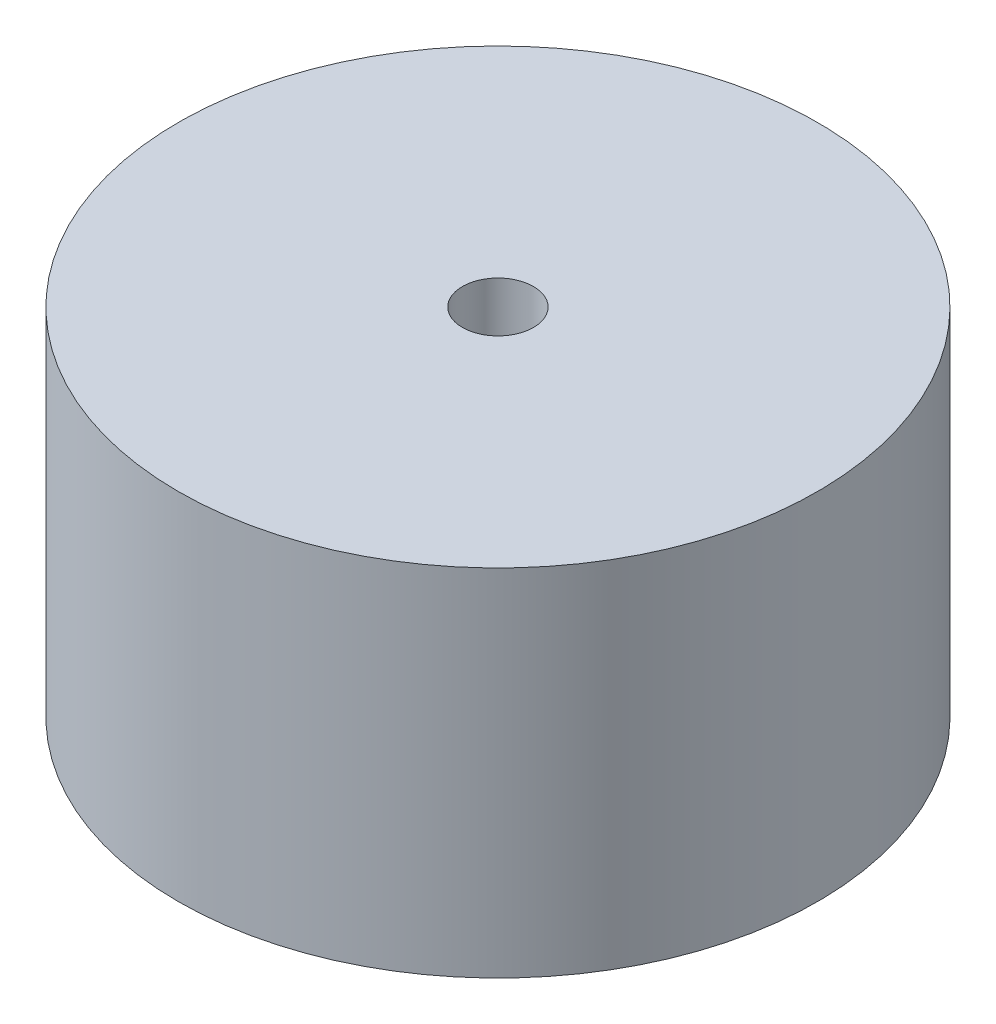
ISO-10303-21;
HEADER;
FILE_DESCRIPTION(('STEP AP214'),'2;1');
FILE_NAME('part.step','',(''),(''),'','','');
FILE_SCHEMA(('AUTOMOTIVE_DESIGN { 1 0 10303 214 1 1 1 1 }'));
ENDSEC;
DATA;
#1=APPLICATION_CONTEXT('core data for automotive mechanical design processes');
#2=APPLICATION_PROTOCOL_DEFINITION('international standard','automotive_design',2000,#1);
#3=PRODUCT_CONTEXT('',#1,'mechanical');
#4=PRODUCT('Part','Part','',(#3));
#5=PRODUCT_RELATED_PRODUCT_CATEGORY('part','',(#4));
#6=PRODUCT_DEFINITION_FORMATION('','',#4);
#7=PRODUCT_DEFINITION_CONTEXT('part definition',#1,'design');
#8=PRODUCT_DEFINITION('design','',#6,#7);
#9=PRODUCT_DEFINITION_SHAPE('','',#8);
#10=(LENGTH_UNIT() NAMED_UNIT(*) SI_UNIT(.MILLI.,.METRE.));
#11=(NAMED_UNIT(*) PLANE_ANGLE_UNIT() SI_UNIT($,.RADIAN.));
#12=(NAMED_UNIT(*) SI_UNIT($,.STERADIAN.) SOLID_ANGLE_UNIT());
#13=UNCERTAINTY_MEASURE_WITH_UNIT(LENGTH_MEASURE(1.E-05),#10,'distance_accuracy_value','');
#14=(GEOMETRIC_REPRESENTATION_CONTEXT(3) GLOBAL_UNCERTAINTY_ASSIGNED_CONTEXT((#13)) GLOBAL_UNIT_ASSIGNED_CONTEXT((#10,
#11,#12)) REPRESENTATION_CONTEXT('',''));
#15=CARTESIAN_POINT('',(0.,0.,0.));
#16=DIRECTION('',(0.,0.,1.));
#17=DIRECTION('',(1.,0.,0.));
#18=AXIS2_PLACEMENT_3D('',#15,#16,#17);
#19=CARTESIAN_POINT('',(0.,5.,0.));
#20=DIRECTION('',(0.,1.,0.));
#21=DIRECTION('',(0.,0.,1.));
#22=AXIS2_PLACEMENT_3D('',#19,#20,#21);
#23=PLANE('',#22);
#24=CARTESIAN_POINT('',(0.,5.,0.));
#25=DIRECTION('',(0.,1.,0.));
#26=DIRECTION('',(0.,0.,1.));
#27=AXIS2_PLACEMENT_3D('',#24,#25,#26);
#28=CIRCLE('',#27,4.5);
#29=CARTESIAN_POINT('',(0.,5.,4.5));
#30=VERTEX_POINT('',#29);
#31=EDGE_CURVE('E10',#30,#30,#28,.T.);
#32=ORIENTED_EDGE('',*,*,#31,.T.);
#33=EDGE_LOOP('',(#32));
#34=FACE_BOUND('',#33,.T.);
#35=CARTESIAN_POINT('',(0.,5.,0.));
#36=DIRECTION('',(0.,1.,0.));
#37=DIRECTION('',(0.,0.,1.));
#38=AXIS2_PLACEMENT_3D('',#35,#36,#37);
#39=CIRCLE('',#38,0.5);
#40=CARTESIAN_POINT('',(0.,5.,0.5));
#41=VERTEX_POINT('',#40);
#42=EDGE_CURVE('E50',#41,#41,#39,.T.);
#43=ORIENTED_EDGE('',*,*,#42,.F.);
#44=EDGE_LOOP('',(#43));
#45=FACE_BOUND('',#44,.T.);
#46=ADVANCED_FACE('F37',(#34,#45),#23,.T.);
#47=CARTESIAN_POINT('',(0.,0.,0.));
#48=DIRECTION('',(0.,1.,0.));
#49=DIRECTION('',(0.,0.,1.));
#50=AXIS2_PLACEMENT_3D('',#47,#48,#49);
#51=PLANE('',#50);
#52=CARTESIAN_POINT('',(0.,0.,0.));
#53=DIRECTION('',(0.,1.,0.));
#54=DIRECTION('',(0.,0.,1.));
#55=AXIS2_PLACEMENT_3D('',#52,#53,#54);
#56=CIRCLE('',#55,4.5);
#57=CARTESIAN_POINT('',(0.,0.,4.5));
#58=VERTEX_POINT('',#57);
#59=EDGE_CURVE('E41',#58,#58,#56,.T.);
#60=ORIENTED_EDGE('',*,*,#59,.F.);
#61=EDGE_LOOP('',(#60));
#62=FACE_BOUND('',#61,.T.);
#63=CARTESIAN_POINT('',(0.,0.,0.));
#64=DIRECTION('',(0.,1.,0.));
#65=DIRECTION('',(0.,0.,1.));
#66=AXIS2_PLACEMENT_3D('',#63,#64,#65);
#67=CIRCLE('',#66,0.5);
#68=CARTESIAN_POINT('',(0.,0.,0.5));
#69=VERTEX_POINT('',#68);
#70=EDGE_CURVE('E52',#69,#69,#67,.T.);
#71=ORIENTED_EDGE('',*,*,#70,.T.);
#72=EDGE_LOOP('',(#71));
#73=FACE_BOUND('',#72,.T.);
#74=ADVANCED_FACE('F64',(#62,#73),#51,.F.);
#75=CARTESIAN_POINT('',(0.,5.,0.));
#76=DIRECTION('',(0.,-1.,0.));
#77=DIRECTION('',(0.,0.,-1.));
#78=AXIS2_PLACEMENT_3D('',#75,#76,#77);
#79=CYLINDRICAL_SURFACE('',#78,4.5);
#80=ORIENTED_EDGE('',*,*,#31,.F.);
#81=EDGE_LOOP('',(#80));
#82=FACE_BOUND('',#81,.T.);
#83=ORIENTED_EDGE('',*,*,#59,.T.);
#84=EDGE_LOOP('',(#83));
#85=FACE_BOUND('',#84,.T.);
#86=ADVANCED_FACE('F39',(#82,#85),#79,.T.);
#87=CARTESIAN_POINT('',(0.,5.,0.));
#88=DIRECTION('',(0.,-1.,0.));
#89=DIRECTION('',(0.,0.,-1.));
#90=AXIS2_PLACEMENT_3D('',#87,#88,#89);
#91=CYLINDRICAL_SURFACE('',#90,0.5);
#92=ORIENTED_EDGE('',*,*,#42,.T.);
#93=EDGE_LOOP('',(#92));
#94=FACE_BOUND('',#93,.T.);
#95=ORIENTED_EDGE('',*,*,#70,.F.);
#96=EDGE_LOOP('',(#95));
#97=FACE_BOUND('',#96,.T.);
#98=ADVANCED_FACE('F60',(#94,#97),#91,.F.);
#99=CLOSED_SHELL('',(#46,#74,#86,#98));
#100=MANIFOLD_SOLID_BREP('B2',#99);
#101=ADVANCED_BREP_SHAPE_REPRESENTATION('',(#18,#100),#14);
#102=SHAPE_DEFINITION_REPRESENTATION(#9,#101);
ENDSEC;
END-ISO-10303-21;
